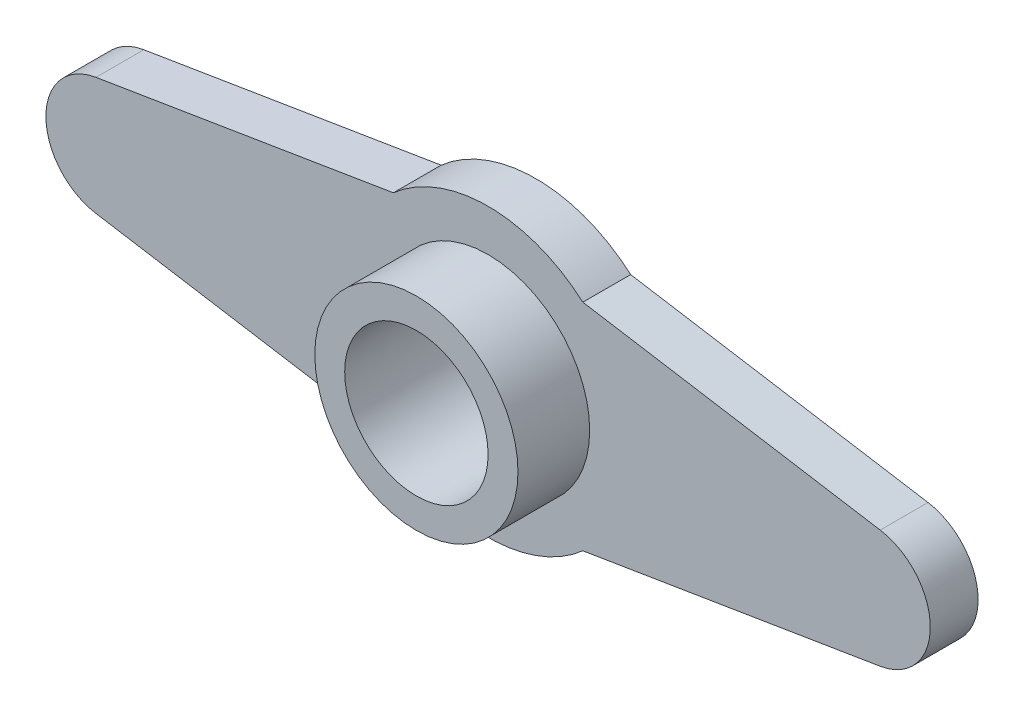
ISO-10303-21;
HEADER;
FILE_DESCRIPTION(('STEP AP214'),'2;1');
FILE_NAME('part.step','',(''),(''),'','','');
FILE_SCHEMA(('AUTOMOTIVE_DESIGN { 1 0 10303 214 1 1 1 1 }'));
ENDSEC;
DATA;
#1=APPLICATION_CONTEXT('core data for automotive mechanical design processes');
#2=APPLICATION_PROTOCOL_DEFINITION('international standard','automotive_design',2000,#1);
#3=PRODUCT_CONTEXT('',#1,'mechanical');
#4=PRODUCT('Part','Part','',(#3));
#5=PRODUCT_RELATED_PRODUCT_CATEGORY('part','',(#4));
#6=PRODUCT_DEFINITION_FORMATION('','',#4);
#7=PRODUCT_DEFINITION_CONTEXT('part definition',#1,'design');
#8=PRODUCT_DEFINITION('design','',#6,#7);
#9=PRODUCT_DEFINITION_SHAPE('','',#8);
#10=(LENGTH_UNIT() NAMED_UNIT(*) SI_UNIT(.MILLI.,.METRE.));
#11=(NAMED_UNIT(*) PLANE_ANGLE_UNIT() SI_UNIT($,.RADIAN.));
#12=(NAMED_UNIT(*) SI_UNIT($,.STERADIAN.) SOLID_ANGLE_UNIT());
#13=UNCERTAINTY_MEASURE_WITH_UNIT(LENGTH_MEASURE(1.E-05),#10,'distance_accuracy_value','');
#14=(GEOMETRIC_REPRESENTATION_CONTEXT(3) GLOBAL_UNCERTAINTY_ASSIGNED_CONTEXT((#13)) GLOBAL_UNIT_ASSIGNED_CONTEXT((#10,
#11,#12)) REPRESENTATION_CONTEXT('',''));
#15=CARTESIAN_POINT('',(0.,0.,0.));
#16=DIRECTION('',(0.,0.,1.));
#17=DIRECTION('',(1.,0.,0.));
#18=AXIS2_PLACEMENT_3D('',#15,#16,#17);
#19=CARTESIAN_POINT('',(0.,0.,2.));
#20=DIRECTION('',(0.,0.,-1.));
#21=DIRECTION('',(-1.,0.,0.));
#22=AXIS2_PLACEMENT_3D('',#19,#20,#21);
#23=CYLINDRICAL_SURFACE('',#22,6.);
#24=CARTESIAN_POINT('',(0.,0.,0.));
#25=DIRECTION('',(0.,0.,1.));
#26=DIRECTION('',(1.,0.,0.));
#27=AXIS2_PLACEMENT_3D('',#24,#25,#26);
#28=CIRCLE('',#27,6.);
#29=CARTESIAN_POINT('',(3.96376736935215,4.50428110153653,0.));
#30=VERTEX_POINT('',#29);
#31=CARTESIAN_POINT('',(-3.96376736935215,4.50428110153653,0.));
#32=VERTEX_POINT('',#31);
#33=EDGE_CURVE('E129',#30,#32,#28,.T.);
#34=ORIENTED_EDGE('',*,*,#33,.T.);
#35=DIRECTION('',(0.,0.,-1.));
#36=VECTOR('',#35,1.);
#37=CARTESIAN_POINT('',(-3.96376736935215,4.50428110153653,2.));
#38=LINE('',#37,#36);
#39=CARTESIAN_POINT('',(-3.96376736935215,4.50428110153653,2.));
#40=VERTEX_POINT('',#39);
#41=EDGE_CURVE('E11',#40,#32,#38,.T.);
#42=ORIENTED_EDGE('',*,*,#41,.F.);
#43=CARTESIAN_POINT('',(0.,0.,2.));
#44=DIRECTION('',(0.,0.,1.));
#45=DIRECTION('',(1.,0.,0.));
#46=AXIS2_PLACEMENT_3D('',#43,#44,#45);
#47=CIRCLE('',#46,6.);
#48=CARTESIAN_POINT('',(3.96376736935215,4.50428110153653,2.));
#49=VERTEX_POINT('',#48);
#50=EDGE_CURVE('E144',#49,#40,#47,.T.);
#51=ORIENTED_EDGE('',*,*,#50,.F.);
#52=DIRECTION('',(0.,0.,-1.));
#53=VECTOR('',#52,1.);
#54=CARTESIAN_POINT('',(3.96376736935215,4.50428110153653,2.));
#55=LINE('',#54,#53);
#56=EDGE_CURVE('E125',#49,#30,#55,.T.);
#57=ORIENTED_EDGE('',*,*,#56,.T.);
#58=EDGE_LOOP('',(#34,#42,#51,#57));
#59=FACE_BOUND('',#58,.T.);
#60=ADVANCED_FACE('F33',(#59),#23,.T.);
#61=CARTESIAN_POINT('',(-3.96376736935215,4.50428110153653,2.));
#62=DIRECTION('',(0.161601814581962,-0.986856044985193,0.));
#63=DIRECTION('',(0.986856044985193,0.161601814581962,0.));
#64=AXIS2_PLACEMENT_3D('',#61,#62,#63);
#65=PLANE('',#64);
#66=DIRECTION('',(-0.986856044985193,-0.161601814581962,0.));
#67=VECTOR('',#66,1.);
#68=CARTESIAN_POINT('',(-3.96376736935215,4.50428110153653,0.));
#69=LINE('',#68,#67);
#70=CARTESIAN_POINT('',(-16.4040045364549,2.46714011197717,0.));
#71=VERTEX_POINT('',#70);
#72=EDGE_CURVE('E132',#32,#71,#69,.T.);
#73=ORIENTED_EDGE('',*,*,#72,.T.);
#74=DIRECTION('',(0.,0.,-1.));
#75=VECTOR('',#74,1.);
#76=CARTESIAN_POINT('',(-16.4040045364549,2.46714011197717,2.));
#77=LINE('',#76,#75);
#78=CARTESIAN_POINT('',(-16.4040045364549,2.46714011197717,2.));
#79=VERTEX_POINT('',#78);
#80=EDGE_CURVE('E41',#79,#71,#77,.T.);
#81=ORIENTED_EDGE('',*,*,#80,.F.);
#82=DIRECTION('',(-0.986856044985193,-0.161601814581962,0.));
#83=VECTOR('',#82,1.);
#84=CARTESIAN_POINT('',(-3.96376736935215,4.50428110153653,2.));
#85=LINE('',#84,#83);
#86=EDGE_CURVE('E92',#40,#79,#85,.T.);
#87=ORIENTED_EDGE('',*,*,#86,.F.);
#88=ORIENTED_EDGE('',*,*,#41,.T.);
#89=EDGE_LOOP('',(#73,#81,#87,#88));
#90=FACE_BOUND('',#89,.T.);
#91=ADVANCED_FACE('F206',(#90),#65,.F.);
#92=CARTESIAN_POINT('',(-16.,-4.85810176809043E-10,2.));
#93=DIRECTION('',(0.,0.,-1.));
#94=DIRECTION('',(-1.,0.,0.));
#95=AXIS2_PLACEMENT_3D('',#92,#93,#94);
#96=CYLINDRICAL_SURFACE('',#95,2.5);
#97=CARTESIAN_POINT('',(-16.,-4.85810176809043E-10,0.));
#98=DIRECTION('',(0.,0.,1.));
#99=DIRECTION('',(1.,0.,0.));
#100=AXIS2_PLACEMENT_3D('',#97,#98,#99);
#101=CIRCLE('',#100,2.5);
#102=CARTESIAN_POINT('',(-16.4040045362672,-2.46714011297952,0.));
#103=VERTEX_POINT('',#102);
#104=EDGE_CURVE('E135',#71,#103,#101,.T.);
#105=ORIENTED_EDGE('',*,*,#104,.T.);
#106=DIRECTION('',(0.,0.,-1.));
#107=VECTOR('',#106,1.);
#108=CARTESIAN_POINT('',(-16.4040045362672,-2.46714011297952,2.));
#109=LINE('',#108,#107);
#110=CARTESIAN_POINT('',(-16.4040045362672,-2.46714011297952,2.));
#111=VERTEX_POINT('',#110);
#112=EDGE_CURVE('E151',#111,#103,#109,.T.);
#113=ORIENTED_EDGE('',*,*,#112,.F.);
#114=CARTESIAN_POINT('',(-16.,-4.85810176809043E-10,2.));
#115=DIRECTION('',(0.,0.,1.));
#116=DIRECTION('',(1.,0.,0.));
#117=AXIS2_PLACEMENT_3D('',#114,#115,#116);
#118=CIRCLE('',#117,2.5);
#119=EDGE_CURVE('E159',#79,#111,#118,.T.);
#120=ORIENTED_EDGE('',*,*,#119,.F.);
#121=ORIENTED_EDGE('',*,*,#80,.T.);
#122=EDGE_LOOP('',(#105,#113,#120,#121));
#123=FACE_BOUND('',#122,.T.);
#124=ADVANCED_FACE('F157',(#123),#96,.T.);
#125=CARTESIAN_POINT('',(-3.96376736935215,-4.50428110153653,2.));
#126=DIRECTION('',(0.161601814506899,0.986856044997485,0.));
#127=DIRECTION('',(-0.986856044997485,0.161601814506899,0.));
#128=AXIS2_PLACEMENT_3D('',#125,#126,#127);
#129=PLANE('',#128);
#130=DIRECTION('',(0.986856044997485,-0.161601814506899,0.));
#131=VECTOR('',#130,1.);
#132=CARTESIAN_POINT('',(-3.96376736935215,-4.50428110153653,0.));
#133=LINE('',#132,#131);
#134=CARTESIAN_POINT('',(-3.96376736935215,-4.50428110153653,0.));
#135=VERTEX_POINT('',#134);
#136=EDGE_CURVE('E137',#103,#135,#133,.T.);
#137=ORIENTED_EDGE('',*,*,#136,.T.);
#138=DIRECTION('',(0.,0.,-1.));
#139=VECTOR('',#138,1.);
#140=CARTESIAN_POINT('',(-3.96376736935215,-4.50428110153653,2.));
#141=LINE('',#140,#139);
#142=CARTESIAN_POINT('',(-3.96376736935215,-4.50428110153653,2.));
#143=VERTEX_POINT('',#142);
#144=EDGE_CURVE('E148',#143,#135,#141,.T.);
#145=ORIENTED_EDGE('',*,*,#144,.F.);
#146=DIRECTION('',(0.986856044997485,-0.161601814506899,0.));
#147=VECTOR('',#146,1.);
#148=CARTESIAN_POINT('',(-3.96376736935215,-4.50428110153653,2.));
#149=LINE('',#148,#147);
#150=EDGE_CURVE('E171',#111,#143,#149,.T.);
#151=ORIENTED_EDGE('',*,*,#150,.F.);
#152=ORIENTED_EDGE('',*,*,#112,.T.);
#153=EDGE_LOOP('',(#137,#145,#151,#152));
#154=FACE_BOUND('',#153,.T.);
#155=ADVANCED_FACE('F167',(#154),#129,.F.);
#156=CARTESIAN_POINT('',(0.,0.,2.));
#157=DIRECTION('',(0.,0.,-1.));
#158=DIRECTION('',(-1.,0.,0.));
#159=AXIS2_PLACEMENT_3D('',#156,#157,#158);
#160=CYLINDRICAL_SURFACE('',#159,6.);
#161=CARTESIAN_POINT('',(0.,0.,0.));
#162=DIRECTION('',(0.,0.,1.));
#163=DIRECTION('',(1.,0.,0.));
#164=AXIS2_PLACEMENT_3D('',#161,#162,#163);
#165=CIRCLE('',#164,6.);
#166=CARTESIAN_POINT('',(3.96376736935215,-4.50428110153653,0.));
#167=VERTEX_POINT('',#166);
#168=EDGE_CURVE('E139',#135,#167,#165,.T.);
#169=ORIENTED_EDGE('',*,*,#168,.T.);
#170=DIRECTION('',(0.,0.,-1.));
#171=VECTOR('',#170,1.);
#172=CARTESIAN_POINT('',(3.96376736935215,-4.50428110153653,2.));
#173=LINE('',#172,#171);
#174=CARTESIAN_POINT('',(3.96376736935215,-4.50428110153653,2.));
#175=VERTEX_POINT('',#174);
#176=EDGE_CURVE('E120',#175,#167,#173,.T.);
#177=ORIENTED_EDGE('',*,*,#176,.F.);
#178=CARTESIAN_POINT('',(0.,0.,2.));
#179=DIRECTION('',(0.,0.,1.));
#180=DIRECTION('',(1.,0.,0.));
#181=AXIS2_PLACEMENT_3D('',#178,#179,#180);
#182=CIRCLE('',#181,6.);
#183=EDGE_CURVE('E111',#143,#175,#182,.T.);
#184=ORIENTED_EDGE('',*,*,#183,.F.);
#185=ORIENTED_EDGE('',*,*,#144,.T.);
#186=EDGE_LOOP('',(#169,#177,#184,#185));
#187=FACE_BOUND('',#186,.T.);
#188=ADVANCED_FACE('F170',(#187),#160,.T.);
#189=CARTESIAN_POINT('',(3.96376736935215,-4.50428110153653,2.));
#190=DIRECTION('',(-0.16160181457327,0.986856044986616,0.));
#191=DIRECTION('',(-0.986856044986616,-0.16160181457327,0.));
#192=AXIS2_PLACEMENT_3D('',#189,#190,#191);
#193=PLANE('',#192);
#194=DIRECTION('',(0.986856044986616,0.16160181457327,0.));
#195=VECTOR('',#194,1.);
#196=CARTESIAN_POINT('',(3.96376736935215,-4.50428110153653,0.));
#197=LINE('',#196,#195);
#198=CARTESIAN_POINT('',(16.4040045364332,-2.46714011209324,0.));
#199=VERTEX_POINT('',#198);
#200=EDGE_CURVE('E119',#167,#199,#197,.T.);
#201=ORIENTED_EDGE('',*,*,#200,.T.);
#202=DIRECTION('',(0.,0.,-1.));
#203=VECTOR('',#202,1.);
#204=CARTESIAN_POINT('',(16.4040045364332,-2.46714011209324,2.));
#205=LINE('',#204,#203);
#206=CARTESIAN_POINT('',(16.4040045364332,-2.46714011209324,2.));
#207=VERTEX_POINT('',#206);
#208=EDGE_CURVE('E116',#207,#199,#205,.T.);
#209=ORIENTED_EDGE('',*,*,#208,.F.);
#210=DIRECTION('',(0.986856044986616,0.16160181457327,0.));
#211=VECTOR('',#210,1.);
#212=CARTESIAN_POINT('',(3.96376736935215,-4.50428110153653,2.));
#213=LINE('',#212,#211);
#214=EDGE_CURVE('E105',#175,#207,#213,.T.);
#215=ORIENTED_EDGE('',*,*,#214,.F.);
#216=ORIENTED_EDGE('',*,*,#176,.T.);
#217=EDGE_LOOP('',(#201,#209,#215,#216));
#218=FACE_BOUND('',#217,.T.);
#219=ADVANCED_FACE('F117',(#218),#193,.F.);
#220=CARTESIAN_POINT('',(16.,3.7330338473196E-10,2.));
#221=DIRECTION('',(0.,0.,-1.));
#222=DIRECTION('',(-1.,0.,0.));
#223=AXIS2_PLACEMENT_3D('',#220,#221,#222);
#224=CYLINDRICAL_SURFACE('',#223,2.5);
#225=CARTESIAN_POINT('',(16.,3.7330338473196E-10,0.));
#226=DIRECTION('',(0.,0.,1.));
#227=DIRECTION('',(1.,0.,0.));
#228=AXIS2_PLACEMENT_3D('',#225,#226,#227);
#229=CIRCLE('',#228,2.5);
#230=CARTESIAN_POINT('',(16.404004536289,2.46714011286346,0.));
#231=VERTEX_POINT('',#230);
#232=EDGE_CURVE('E78',#199,#231,#229,.T.);
#233=ORIENTED_EDGE('',*,*,#232,.T.);
#234=DIRECTION('',(0.,0.,-1.));
#235=VECTOR('',#234,1.);
#236=CARTESIAN_POINT('',(16.404004536289,2.46714011286346,2.));
#237=LINE('',#236,#235);
#238=CARTESIAN_POINT('',(16.404004536289,2.46714011286346,2.));
#239=VERTEX_POINT('',#238);
#240=EDGE_CURVE('E121',#239,#231,#237,.T.);
#241=ORIENTED_EDGE('',*,*,#240,.F.);
#242=CARTESIAN_POINT('',(16.,3.7330338473196E-10,2.));
#243=DIRECTION('',(0.,0.,1.));
#244=DIRECTION('',(1.,0.,0.));
#245=AXIS2_PLACEMENT_3D('',#242,#243,#244);
#246=CIRCLE('',#245,2.5);
#247=EDGE_CURVE('E109',#207,#239,#246,.T.);
#248=ORIENTED_EDGE('',*,*,#247,.F.);
#249=ORIENTED_EDGE('',*,*,#208,.T.);
#250=EDGE_LOOP('',(#233,#241,#248,#249));
#251=FACE_BOUND('',#250,.T.);
#252=ADVANCED_FACE('F123',(#251),#224,.T.);
#253=CARTESIAN_POINT('',(3.96376736935215,4.50428110153653,2.));
#254=DIRECTION('',(-0.16160181451559,-0.986856044996062,0.));
#255=DIRECTION('',(0.986856044996062,-0.16160181451559,0.));
#256=AXIS2_PLACEMENT_3D('',#253,#254,#255);
#257=PLANE('',#256);
#258=DIRECTION('',(-0.986856044996062,0.16160181451559,0.));
#259=VECTOR('',#258,1.);
#260=CARTESIAN_POINT('',(3.96376736935215,4.50428110153653,0.));
#261=LINE('',#260,#259);
#262=EDGE_CURVE('E84',#231,#30,#261,.T.);
#263=ORIENTED_EDGE('',*,*,#262,.T.);
#264=ORIENTED_EDGE('',*,*,#56,.F.);
#265=DIRECTION('',(-0.986856044996062,0.16160181451559,0.));
#266=VECTOR('',#265,1.);
#267=CARTESIAN_POINT('',(3.96376736935215,4.50428110153653,2.));
#268=LINE('',#267,#266);
#269=EDGE_CURVE('E49',#239,#49,#268,.T.);
#270=ORIENTED_EDGE('',*,*,#269,.F.);
#271=ORIENTED_EDGE('',*,*,#240,.T.);
#272=EDGE_LOOP('',(#263,#264,#270,#271));
#273=FACE_BOUND('',#272,.T.);
#274=ADVANCED_FACE('F201',(#273),#257,.F.);
#275=CARTESIAN_POINT('',(0.,0.,2.));
#276=DIRECTION('',(0.,0.,1.));
#277=DIRECTION('',(1.,0.,0.));
#278=AXIS2_PLACEMENT_3D('',#275,#276,#277);
#279=PLANE('',#278);
#280=CARTESIAN_POINT('',(0.,0.,2.));
#281=DIRECTION('',(0.,0.,1.));
#282=DIRECTION('',(1.,0.,0.));
#283=AXIS2_PLACEMENT_3D('',#280,#281,#282);
#284=CIRCLE('',#283,4.25);
#285=CARTESIAN_POINT('',(4.25,0.,2.));
#286=VERTEX_POINT('',#285);
#287=EDGE_CURVE('E177',#286,#286,#284,.T.);
#288=ORIENTED_EDGE('',*,*,#287,.F.);
#289=EDGE_LOOP('',(#288));
#290=FACE_BOUND('',#289,.T.);
#291=ORIENTED_EDGE('',*,*,#50,.T.);
#292=ORIENTED_EDGE('',*,*,#86,.T.);
#293=ORIENTED_EDGE('',*,*,#119,.T.);
#294=ORIENTED_EDGE('',*,*,#150,.T.);
#295=ORIENTED_EDGE('',*,*,#183,.T.);
#296=ORIENTED_EDGE('',*,*,#214,.T.);
#297=ORIENTED_EDGE('',*,*,#247,.T.);
#298=ORIENTED_EDGE('',*,*,#269,.T.);
#299=EDGE_LOOP('',(#291,#292,#293,#294,#295,#296,#297,#298));
#300=FACE_BOUND('',#299,.T.);
#301=ADVANCED_FACE('F107',(#290,#300),#279,.T.);
#302=CARTESIAN_POINT('',(0.,0.,0.));
#303=DIRECTION('',(0.,0.,1.));
#304=DIRECTION('',(1.,0.,0.));
#305=AXIS2_PLACEMENT_3D('',#302,#303,#304);
#306=PLANE('',#305);
#307=CARTESIAN_POINT('',(0.,0.,0.));
#308=DIRECTION('',(0.,0.,-1.));
#309=DIRECTION('',(-1.,0.,0.));
#310=AXIS2_PLACEMENT_3D('',#307,#308,#309);
#311=CIRCLE('',#310,3.);
#312=CARTESIAN_POINT('',(-3.,0.,0.));
#313=VERTEX_POINT('',#312);
#314=EDGE_CURVE('E180',#313,#313,#311,.T.);
#315=ORIENTED_EDGE('',*,*,#314,.F.);
#316=EDGE_LOOP('',(#315));
#317=FACE_BOUND('',#316,.T.);
#318=ORIENTED_EDGE('',*,*,#33,.F.);
#319=ORIENTED_EDGE('',*,*,#262,.F.);
#320=ORIENTED_EDGE('',*,*,#232,.F.);
#321=ORIENTED_EDGE('',*,*,#200,.F.);
#322=ORIENTED_EDGE('',*,*,#168,.F.);
#323=ORIENTED_EDGE('',*,*,#136,.F.);
#324=ORIENTED_EDGE('',*,*,#104,.F.);
#325=ORIENTED_EDGE('',*,*,#72,.F.);
#326=EDGE_LOOP('',(#318,#319,#320,#321,#322,#323,#324,#325));
#327=FACE_BOUND('',#326,.T.);
#328=ADVANCED_FACE('F163',(#317,#327),#306,.F.);
#329=CARTESIAN_POINT('',(0.,0.,5.));
#330=DIRECTION('',(0.,0.,-1.));
#331=DIRECTION('',(-1.,0.,0.));
#332=AXIS2_PLACEMENT_3D('',#329,#330,#331);
#333=CYLINDRICAL_SURFACE('',#332,4.25);
#334=CARTESIAN_POINT('',(0.,0.,5.));
#335=DIRECTION('',(0.,0.,1.));
#336=DIRECTION('',(1.,0.,0.));
#337=AXIS2_PLACEMENT_3D('',#334,#335,#336);
#338=CIRCLE('',#337,4.25);
#339=CARTESIAN_POINT('',(4.25,0.,5.));
#340=VERTEX_POINT('',#339);
#341=EDGE_CURVE('E133',#340,#340,#338,.T.);
#342=ORIENTED_EDGE('',*,*,#341,.F.);
#343=EDGE_LOOP('',(#342));
#344=FACE_BOUND('',#343,.T.);
#345=ORIENTED_EDGE('',*,*,#287,.T.);
#346=EDGE_LOOP('',(#345));
#347=FACE_BOUND('',#346,.T.);
#348=ADVANCED_FACE('F192',(#344,#347),#333,.T.);
#349=CARTESIAN_POINT('',(0.,0.,5.));
#350=DIRECTION('',(0.,0.,1.));
#351=DIRECTION('',(1.,0.,0.));
#352=AXIS2_PLACEMENT_3D('',#349,#350,#351);
#353=PLANE('',#352);
#354=CARTESIAN_POINT('',(0.,0.,5.));
#355=DIRECTION('',(0.,0.,1.));
#356=DIRECTION('',(1.,0.,0.));
#357=AXIS2_PLACEMENT_3D('',#354,#355,#356);
#358=CIRCLE('',#357,3.);
#359=CARTESIAN_POINT('',(3.,0.,5.));
#360=VERTEX_POINT('',#359);
#361=EDGE_CURVE('E183',#360,#360,#358,.F.);
#362=ORIENTED_EDGE('',*,*,#361,.T.);
#363=EDGE_LOOP('',(#362));
#364=FACE_BOUND('',#363,.T.);
#365=ORIENTED_EDGE('',*,*,#341,.T.);
#366=EDGE_LOOP('',(#365));
#367=FACE_BOUND('',#366,.T.);
#368=ADVANCED_FACE('F198',(#364,#367),#353,.T.);
#369=CARTESIAN_POINT('',(0.,0.,5.001));
#370=DIRECTION('',(0.,0.,-1.));
#371=DIRECTION('',(-1.,0.,0.));
#372=AXIS2_PLACEMENT_3D('',#369,#370,#371);
#373=CYLINDRICAL_SURFACE('',#372,3.);
#374=ORIENTED_EDGE('',*,*,#361,.F.);
#375=EDGE_LOOP('',(#374));
#376=FACE_BOUND('',#375,.T.);
#377=ORIENTED_EDGE('',*,*,#314,.T.);
#378=EDGE_LOOP('',(#377));
#379=FACE_BOUND('',#378,.T.);
#380=ADVANCED_FACE('F189',(#376,#379),#373,.F.);
#381=CLOSED_SHELL('',(#60,#91,#124,#155,#188,#219,#252,#274,#301,#328,#348,#368,#380));
#382=MANIFOLD_SOLID_BREP('B2',#381);
#383=ADVANCED_BREP_SHAPE_REPRESENTATION('',(#18,#382),#14);
#384=SHAPE_DEFINITION_REPRESENTATION(#9,#383);
ENDSEC;
END-ISO-10303-21;
